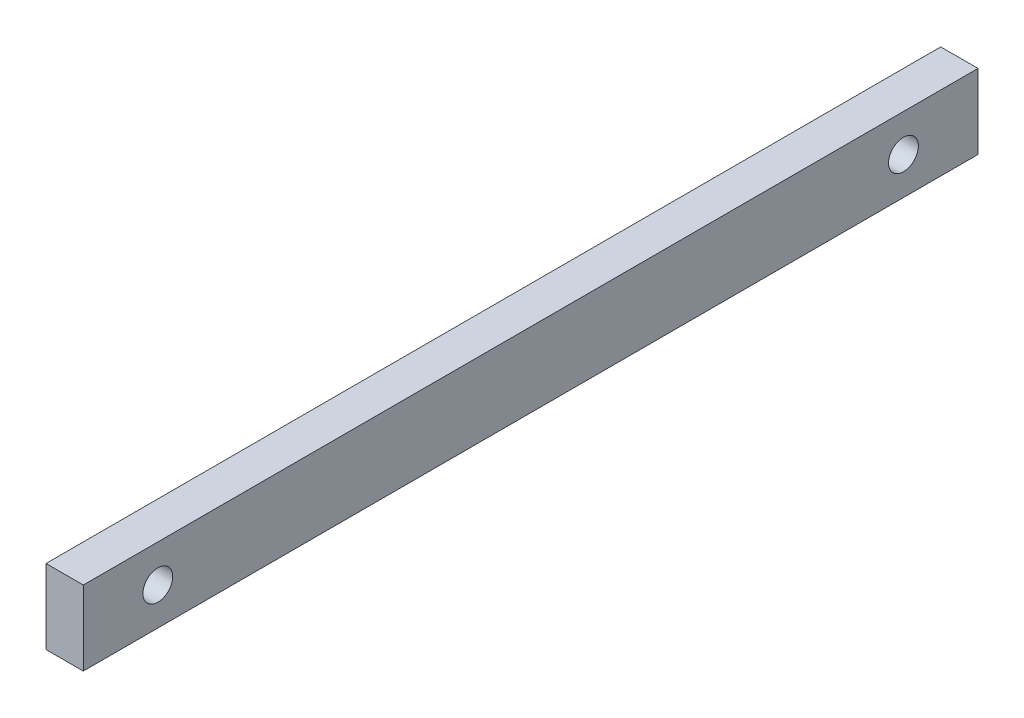
ISO-10303-21;
HEADER;
FILE_DESCRIPTION(('STEP AP214'),'2;1');
FILE_NAME('part.step','',(''),(''),'','','');
FILE_SCHEMA(('AUTOMOTIVE_DESIGN { 1 0 10303 214 1 1 1 1 }'));
ENDSEC;
DATA;
#1=APPLICATION_CONTEXT('core data for automotive mechanical design processes');
#2=APPLICATION_PROTOCOL_DEFINITION('international standard','automotive_design',2000,#1);
#3=PRODUCT_CONTEXT('',#1,'mechanical');
#4=PRODUCT('Part','Part','',(#3));
#5=PRODUCT_RELATED_PRODUCT_CATEGORY('part','',(#4));
#6=PRODUCT_DEFINITION_FORMATION('','',#4);
#7=PRODUCT_DEFINITION_CONTEXT('part definition',#1,'design');
#8=PRODUCT_DEFINITION('design','',#6,#7);
#9=PRODUCT_DEFINITION_SHAPE('','',#8);
#10=(LENGTH_UNIT() NAMED_UNIT(*) SI_UNIT(.MILLI.,.METRE.));
#11=(NAMED_UNIT(*) PLANE_ANGLE_UNIT() SI_UNIT($,.RADIAN.));
#12=(NAMED_UNIT(*) SI_UNIT($,.STERADIAN.) SOLID_ANGLE_UNIT());
#13=UNCERTAINTY_MEASURE_WITH_UNIT(LENGTH_MEASURE(1.E-05),#10,'distance_accuracy_value','');
#14=(GEOMETRIC_REPRESENTATION_CONTEXT(3) GLOBAL_UNCERTAINTY_ASSIGNED_CONTEXT((#13)) GLOBAL_UNIT_ASSIGNED_CONTEXT((#10,
#11,#12)) REPRESENTATION_CONTEXT('',''));
#15=CARTESIAN_POINT('',(0.,0.,0.));
#16=DIRECTION('',(0.,0.,1.));
#17=DIRECTION('',(1.,0.,0.));
#18=AXIS2_PLACEMENT_3D('',#15,#16,#17);
#19=CARTESIAN_POINT('',(5.,0.,0.));
#20=DIRECTION('',(-1.,0.,0.));
#21=DIRECTION('',(0.,0.,1.));
#22=AXIS2_PLACEMENT_3D('',#19,#20,#21);
#23=PLANE('',#22);
#24=DIRECTION('',(0.,0.,-1.));
#25=VECTOR('',#24,1.);
#26=CARTESIAN_POINT('',(5.,-5.,60.));
#27=LINE('',#26,#25);
#28=CARTESIAN_POINT('',(5.,-5.,60.));
#29=VERTEX_POINT('',#28);
#30=CARTESIAN_POINT('',(5.,-5.,-60.));
#31=VERTEX_POINT('',#30);
#32=EDGE_CURVE('E104',#29,#31,#27,.T.);
#33=ORIENTED_EDGE('',*,*,#32,.T.);
#34=DIRECTION('',(0.,-1.,0.));
#35=VECTOR('',#34,1.);
#36=CARTESIAN_POINT('',(5.,5.,-60.));
#37=LINE('',#36,#35);
#38=CARTESIAN_POINT('',(5.,5.,-60.));
#39=VERTEX_POINT('',#38);
#40=EDGE_CURVE('E111',#39,#31,#37,.T.);
#41=ORIENTED_EDGE('',*,*,#40,.F.);
#42=DIRECTION('',(0.,0.,-1.));
#43=VECTOR('',#42,1.);
#44=CARTESIAN_POINT('',(5.,5.,60.));
#45=LINE('',#44,#43);
#46=CARTESIAN_POINT('',(5.,5.,60.));
#47=VERTEX_POINT('',#46);
#48=EDGE_CURVE('E119',#47,#39,#45,.T.);
#49=ORIENTED_EDGE('',*,*,#48,.F.);
#50=DIRECTION('',(0.,-1.,0.));
#51=VECTOR('',#50,1.);
#52=CARTESIAN_POINT('',(5.,5.,60.));
#53=LINE('',#52,#51);
#54=EDGE_CURVE('E81',#47,#29,#53,.T.);
#55=ORIENTED_EDGE('',*,*,#54,.T.);
#56=EDGE_LOOP('',(#33,#41,#49,#55));
#57=FACE_BOUND('',#56,.T.);
#58=CARTESIAN_POINT('',(5.,0.,50.));
#59=DIRECTION('',(1.,0.,0.));
#60=DIRECTION('',(0.,0.,-1.));
#61=AXIS2_PLACEMENT_3D('',#58,#59,#60);
#62=CIRCLE('',#61,2.);
#63=CARTESIAN_POINT('',(5.,0.,48.));
#64=VERTEX_POINT('',#63);
#65=EDGE_CURVE('E130',#64,#64,#62,.T.);
#66=ORIENTED_EDGE('',*,*,#65,.F.);
#67=EDGE_LOOP('',(#66));
#68=FACE_BOUND('',#67,.T.);
#69=CARTESIAN_POINT('',(5.,0.,-50.));
#70=DIRECTION('',(1.,0.,0.));
#71=DIRECTION('',(0.,0.,-1.));
#72=AXIS2_PLACEMENT_3D('',#69,#70,#71);
#73=CIRCLE('',#72,2.);
#74=CARTESIAN_POINT('',(5.,0.,-52.));
#75=VERTEX_POINT('',#74);
#76=EDGE_CURVE('E148',#75,#75,#73,.T.);
#77=ORIENTED_EDGE('',*,*,#76,.F.);
#78=EDGE_LOOP('',(#77));
#79=FACE_BOUND('',#78,.T.);
#80=ADVANCED_FACE('F64',(#57,#68,#79),#23,.F.);
#81=CARTESIAN_POINT('',(0.,0.,0.));
#82=DIRECTION('',(-1.,0.,0.));
#83=DIRECTION('',(0.,0.,1.));
#84=AXIS2_PLACEMENT_3D('',#81,#82,#83);
#85=PLANE('',#84);
#86=CARTESIAN_POINT('',(0.,0.,50.));
#87=DIRECTION('',(1.,0.,0.));
#88=DIRECTION('',(0.,0.,-1.));
#89=AXIS2_PLACEMENT_3D('',#86,#87,#88);
#90=CIRCLE('',#89,2.);
#91=CARTESIAN_POINT('',(0.,0.,48.));
#92=VERTEX_POINT('',#91);
#93=EDGE_CURVE('E151',#92,#92,#90,.T.);
#94=ORIENTED_EDGE('',*,*,#93,.T.);
#95=EDGE_LOOP('',(#94));
#96=FACE_BOUND('',#95,.T.);
#97=DIRECTION('',(0.,0.,-1.));
#98=VECTOR('',#97,1.);
#99=CARTESIAN_POINT('',(0.,-5.,60.));
#100=LINE('',#99,#98);
#101=CARTESIAN_POINT('',(0.,-5.,60.));
#102=VERTEX_POINT('',#101);
#103=CARTESIAN_POINT('',(0.,-5.,-60.));
#104=VERTEX_POINT('',#103);
#105=EDGE_CURVE('E127',#102,#104,#100,.T.);
#106=ORIENTED_EDGE('',*,*,#105,.F.);
#107=DIRECTION('',(0.,-1.,0.));
#108=VECTOR('',#107,1.);
#109=CARTESIAN_POINT('',(0.,5.,60.));
#110=LINE('',#109,#108);
#111=CARTESIAN_POINT('',(0.,5.,60.));
#112=VERTEX_POINT('',#111);
#113=EDGE_CURVE('E99',#112,#102,#110,.T.);
#114=ORIENTED_EDGE('',*,*,#113,.F.);
#115=DIRECTION('',(0.,0.,-1.));
#116=VECTOR('',#115,1.);
#117=CARTESIAN_POINT('',(0.,5.,60.));
#118=LINE('',#117,#116);
#119=CARTESIAN_POINT('',(0.,5.,-60.));
#120=VERTEX_POINT('',#119);
#121=EDGE_CURVE('E132',#112,#120,#118,.T.);
#122=ORIENTED_EDGE('',*,*,#121,.T.);
#123=DIRECTION('',(0.,-1.,0.));
#124=VECTOR('',#123,1.);
#125=CARTESIAN_POINT('',(0.,5.,-60.));
#126=LINE('',#125,#124);
#127=EDGE_CURVE('E113',#120,#104,#126,.T.);
#128=ORIENTED_EDGE('',*,*,#127,.T.);
#129=EDGE_LOOP('',(#106,#114,#122,#128));
#130=FACE_BOUND('',#129,.T.);
#131=CARTESIAN_POINT('',(0.,0.,-50.));
#132=DIRECTION('',(1.,0.,0.));
#133=DIRECTION('',(0.,0.,-1.));
#134=AXIS2_PLACEMENT_3D('',#131,#132,#133);
#135=CIRCLE('',#134,2.);
#136=CARTESIAN_POINT('',(0.,0.,-52.));
#137=VERTEX_POINT('',#136);
#138=EDGE_CURVE('E146',#137,#137,#135,.T.);
#139=ORIENTED_EDGE('',*,*,#138,.T.);
#140=EDGE_LOOP('',(#139));
#141=FACE_BOUND('',#140,.T.);
#142=ADVANCED_FACE('F139',(#96,#130,#141),#85,.T.);
#143=CARTESIAN_POINT('',(5.,-5.,60.));
#144=DIRECTION('',(0.,1.,0.));
#145=DIRECTION('',(0.,0.,1.));
#146=AXIS2_PLACEMENT_3D('',#143,#144,#145);
#147=PLANE('',#146);
#148=ORIENTED_EDGE('',*,*,#105,.T.);
#149=DIRECTION('',(-1.,0.,0.));
#150=VECTOR('',#149,1.);
#151=CARTESIAN_POINT('',(5.,-5.,-60.));
#152=LINE('',#151,#150);
#153=EDGE_CURVE('E12',#31,#104,#152,.T.);
#154=ORIENTED_EDGE('',*,*,#153,.F.);
#155=ORIENTED_EDGE('',*,*,#32,.F.);
#156=DIRECTION('',(-1.,0.,0.));
#157=VECTOR('',#156,1.);
#158=CARTESIAN_POINT('',(5.,-5.,60.));
#159=LINE('',#158,#157);
#160=EDGE_CURVE('E123',#29,#102,#159,.T.);
#161=ORIENTED_EDGE('',*,*,#160,.T.);
#162=EDGE_LOOP('',(#148,#154,#155,#161));
#163=FACE_BOUND('',#162,.T.);
#164=ADVANCED_FACE('F66',(#163),#147,.F.);
#165=CARTESIAN_POINT('',(5.,5.,-60.));
#166=DIRECTION('',(0.,0.,-1.));
#167=DIRECTION('',(-1.,0.,0.));
#168=AXIS2_PLACEMENT_3D('',#165,#166,#167);
#169=PLANE('',#168);
#170=ORIENTED_EDGE('',*,*,#127,.F.);
#171=DIRECTION('',(-1.,0.,0.));
#172=VECTOR('',#171,1.);
#173=CARTESIAN_POINT('',(5.,5.,-60.));
#174=LINE('',#173,#172);
#175=EDGE_CURVE('E73',#39,#120,#174,.T.);
#176=ORIENTED_EDGE('',*,*,#175,.F.);
#177=ORIENTED_EDGE('',*,*,#40,.T.);
#178=ORIENTED_EDGE('',*,*,#153,.T.);
#179=EDGE_LOOP('',(#170,#176,#177,#178));
#180=FACE_BOUND('',#179,.T.);
#181=ADVANCED_FACE('F110',(#180),#169,.T.);
#182=CARTESIAN_POINT('',(5.,5.,60.));
#183=DIRECTION('',(0.,1.,0.));
#184=DIRECTION('',(0.,0.,1.));
#185=AXIS2_PLACEMENT_3D('',#182,#183,#184);
#186=PLANE('',#185);
#187=ORIENTED_EDGE('',*,*,#121,.F.);
#188=DIRECTION('',(-1.,0.,0.));
#189=VECTOR('',#188,1.);
#190=CARTESIAN_POINT('',(5.,5.,60.));
#191=LINE('',#190,#189);
#192=EDGE_CURVE('E96',#47,#112,#191,.T.);
#193=ORIENTED_EDGE('',*,*,#192,.F.);
#194=ORIENTED_EDGE('',*,*,#48,.T.);
#195=ORIENTED_EDGE('',*,*,#175,.T.);
#196=EDGE_LOOP('',(#187,#193,#194,#195));
#197=FACE_BOUND('',#196,.T.);
#198=ADVANCED_FACE('F121',(#197),#186,.T.);
#199=CARTESIAN_POINT('',(5.,5.,60.));
#200=DIRECTION('',(0.,0.,-1.));
#201=DIRECTION('',(-1.,0.,0.));
#202=AXIS2_PLACEMENT_3D('',#199,#200,#201);
#203=PLANE('',#202);
#204=ORIENTED_EDGE('',*,*,#113,.T.);
#205=ORIENTED_EDGE('',*,*,#160,.F.);
#206=ORIENTED_EDGE('',*,*,#54,.F.);
#207=ORIENTED_EDGE('',*,*,#192,.T.);
#208=EDGE_LOOP('',(#204,#205,#206,#207));
#209=FACE_BOUND('',#208,.T.);
#210=ADVANCED_FACE('F162',(#209),#203,.F.);
#211=CARTESIAN_POINT('',(5.,0.,50.));
#212=DIRECTION('',(-1.,0.,0.));
#213=DIRECTION('',(0.,0.,1.));
#214=AXIS2_PLACEMENT_3D('',#211,#212,#213);
#215=CYLINDRICAL_SURFACE('',#214,2.);
#216=ORIENTED_EDGE('',*,*,#65,.T.);
#217=EDGE_LOOP('',(#216));
#218=FACE_BOUND('',#217,.T.);
#219=ORIENTED_EDGE('',*,*,#93,.F.);
#220=EDGE_LOOP('',(#219));
#221=FACE_BOUND('',#220,.T.);
#222=ADVANCED_FACE('F159',(#218,#221),#215,.F.);
#223=CARTESIAN_POINT('',(5.,0.,-50.));
#224=DIRECTION('',(-1.,0.,0.));
#225=DIRECTION('',(0.,0.,1.));
#226=AXIS2_PLACEMENT_3D('',#223,#224,#225);
#227=CYLINDRICAL_SURFACE('',#226,2.);
#228=ORIENTED_EDGE('',*,*,#76,.T.);
#229=EDGE_LOOP('',(#228));
#230=FACE_BOUND('',#229,.T.);
#231=ORIENTED_EDGE('',*,*,#138,.F.);
#232=EDGE_LOOP('',(#231));
#233=FACE_BOUND('',#232,.T.);
#234=ADVANCED_FACE('F161',(#230,#233),#227,.F.);
#235=CLOSED_SHELL('',(#80,#142,#164,#181,#198,#210,#222,#234));
#236=MANIFOLD_SOLID_BREP('B2',#235);
#237=ADVANCED_BREP_SHAPE_REPRESENTATION('',(#18,#236),#14);
#238=SHAPE_DEFINITION_REPRESENTATION(#9,#237);
ENDSEC;
END-ISO-10303-21;
